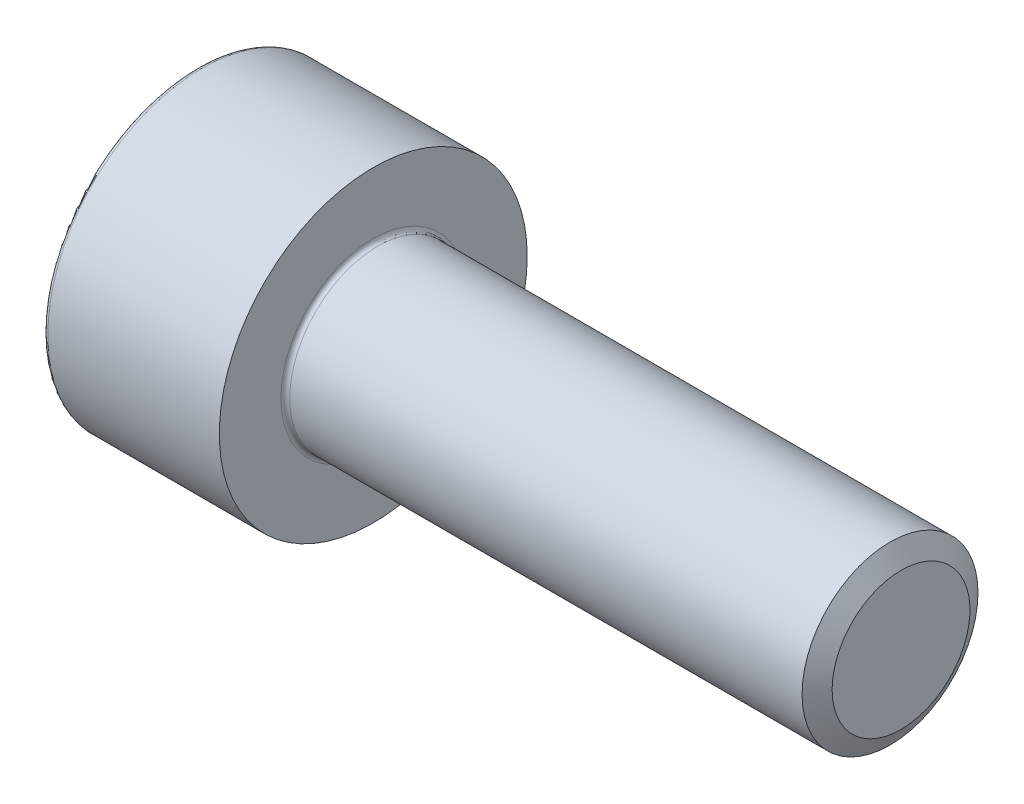
ISO-10303-21;
HEADER;
FILE_DESCRIPTION(('STEP AP214'),'2;1');
FILE_NAME('part.step','',(''),(''),'','','');
FILE_SCHEMA(('AUTOMOTIVE_DESIGN { 1 0 10303 214 1 1 1 1 }'));
ENDSEC;
DATA;
#1=APPLICATION_CONTEXT('core data for automotive mechanical design processes');
#2=APPLICATION_PROTOCOL_DEFINITION('international standard','automotive_design',2000,#1);
#3=PRODUCT_CONTEXT('',#1,'mechanical');
#4=PRODUCT('Part','Part','',(#3));
#5=PRODUCT_RELATED_PRODUCT_CATEGORY('part','',(#4));
#6=PRODUCT_DEFINITION_FORMATION('','',#4);
#7=PRODUCT_DEFINITION_CONTEXT('part definition',#1,'design');
#8=PRODUCT_DEFINITION('design','',#6,#7);
#9=PRODUCT_DEFINITION_SHAPE('','',#8);
#10=(LENGTH_UNIT() NAMED_UNIT(*) SI_UNIT(.MILLI.,.METRE.));
#11=(NAMED_UNIT(*) PLANE_ANGLE_UNIT() SI_UNIT($,.RADIAN.));
#12=(NAMED_UNIT(*) SI_UNIT($,.STERADIAN.) SOLID_ANGLE_UNIT());
#13=UNCERTAINTY_MEASURE_WITH_UNIT(LENGTH_MEASURE(1.E-05),#10,'distance_accuracy_value','');
#14=(GEOMETRIC_REPRESENTATION_CONTEXT(3) GLOBAL_UNCERTAINTY_ASSIGNED_CONTEXT((#13)) GLOBAL_UNIT_ASSIGNED_CONTEXT((#10,
#11,#12)) REPRESENTATION_CONTEXT('',''));
#15=CARTESIAN_POINT('',(0.,0.,0.));
#16=DIRECTION('',(0.,0.,1.));
#17=DIRECTION('',(1.,0.,0.));
#18=AXIS2_PLACEMENT_3D('',#15,#16,#17);
#19=CARTESIAN_POINT('',(0.,0.,0.));
#20=DIRECTION('',(1.,0.,0.));
#21=DIRECTION('',(0.,0.,-1.));
#22=AXIS2_PLACEMENT_3D('',#19,#20,#21);
#23=CYLINDRICAL_SURFACE('',#22,2.);
#24=CARTESIAN_POINT('',(4.1,0.,0.));
#25=DIRECTION('',(1.,0.,0.));
#26=DIRECTION('',(0.,0.,-1.));
#27=AXIS2_PLACEMENT_3D('',#24,#25,#26);
#28=CIRCLE('',#27,2.);
#29=CARTESIAN_POINT('',(4.1,0.,-2.));
#30=VERTEX_POINT('',#29);
#31=EDGE_CURVE('E154',#30,#30,#28,.T.);
#32=ORIENTED_EDGE('',*,*,#31,.T.);
#33=EDGE_LOOP('',(#32));
#34=FACE_BOUND('',#33,.T.);
#35=CARTESIAN_POINT('',(15.75,0.,0.));
#36=DIRECTION('',(-1.,0.,0.));
#37=DIRECTION('',(0.,0.,1.));
#38=AXIS2_PLACEMENT_3D('',#35,#36,#37);
#39=CIRCLE('',#38,2.);
#40=CARTESIAN_POINT('',(15.75,0.,2.));
#41=VERTEX_POINT('',#40);
#42=EDGE_CURVE('E299',#41,#41,#39,.T.);
#43=ORIENTED_EDGE('',*,*,#42,.T.);
#44=EDGE_LOOP('',(#43));
#45=FACE_BOUND('',#44,.T.);
#46=ADVANCED_FACE('F51',(#34,#45),#23,.T.);
#47=CARTESIAN_POINT('',(0.,0.,0.));
#48=DIRECTION('',(-1.,0.,0.));
#49=DIRECTION('',(0.,0.,1.));
#50=AXIS2_PLACEMENT_3D('',#47,#48,#49);
#51=PLANE('',#50);
#52=CARTESIAN_POINT('',(0.,0.,0.));
#53=DIRECTION('',(-1.,0.,0.));
#54=DIRECTION('',(0.,0.,1.));
#55=AXIS2_PLACEMENT_3D('',#52,#53,#54);
#56=CIRCLE('',#55,3.4);
#57=CARTESIAN_POINT('',(0.,0.,3.4));
#58=VERTEX_POINT('',#57);
#59=EDGE_CURVE('E11',#58,#58,#56,.T.);
#60=ORIENTED_EDGE('',*,*,#59,.T.);
#61=EDGE_LOOP('',(#60));
#62=FACE_BOUND('',#61,.T.);
#63=DIRECTION('',(0.,0.5,0.866025403784439));
#64=VECTOR('',#63,1.);
#65=CARTESIAN_POINT('',(0.,-1.7215,0.));
#66=LINE('',#65,#64);
#67=CARTESIAN_POINT('',(0.,-1.7215,0.));
#68=VERTEX_POINT('',#67);
#69=CARTESIAN_POINT('',(0.,-0.86075,1.49086273261491));
#70=VERTEX_POINT('',#69);
#71=EDGE_CURVE('E66',#68,#70,#66,.T.);
#72=ORIENTED_EDGE('',*,*,#71,.F.);
#73=DIRECTION('',(0.,-0.5,0.866025403784439));
#74=VECTOR('',#73,1.);
#75=CARTESIAN_POINT('',(0.,-0.86075,-1.49086273261491));
#76=LINE('',#75,#74);
#77=CARTESIAN_POINT('',(0.,-0.86075,-1.49086273261491));
#78=VERTEX_POINT('',#77);
#79=EDGE_CURVE('E150',#78,#68,#76,.T.);
#80=ORIENTED_EDGE('',*,*,#79,.F.);
#81=DIRECTION('',(0.,-1.,0.));
#82=VECTOR('',#81,1.);
#83=CARTESIAN_POINT('',(0.,0.86075,-1.49086273261491));
#84=LINE('',#83,#82);
#85=CARTESIAN_POINT('',(0.,0.86075,-1.49086273261491));
#86=VERTEX_POINT('',#85);
#87=EDGE_CURVE('E148',#86,#78,#84,.T.);
#88=ORIENTED_EDGE('',*,*,#87,.F.);
#89=DIRECTION('',(0.,-0.5,-0.866025403784439));
#90=VECTOR('',#89,1.);
#91=CARTESIAN_POINT('',(0.,1.7215,0.));
#92=LINE('',#91,#90);
#93=CARTESIAN_POINT('',(0.,1.7215,0.));
#94=VERTEX_POINT('',#93);
#95=EDGE_CURVE('E114',#94,#86,#92,.T.);
#96=ORIENTED_EDGE('',*,*,#95,.F.);
#97=DIRECTION('',(0.,0.5,-0.866025403784438));
#98=VECTOR('',#97,1.);
#99=CARTESIAN_POINT('',(0.,0.86075,1.49086273261491));
#100=LINE('',#99,#98);
#101=CARTESIAN_POINT('',(0.,0.86075,1.49086273261491));
#102=VERTEX_POINT('',#101);
#103=EDGE_CURVE('E144',#102,#94,#100,.T.);
#104=ORIENTED_EDGE('',*,*,#103,.F.);
#105=DIRECTION('',(0.,1.,0.));
#106=VECTOR('',#105,1.);
#107=CARTESIAN_POINT('',(0.,-0.86075,1.49086273261491));
#108=LINE('',#107,#106);
#109=EDGE_CURVE('E140',#70,#102,#108,.T.);
#110=ORIENTED_EDGE('',*,*,#109,.F.);
#111=EDGE_LOOP('',(#72,#80,#88,#96,#104,#110));
#112=FACE_BOUND('',#111,.T.);
#113=ADVANCED_FACE('F190',(#62,#112),#51,.T.);
#114=CARTESIAN_POINT('',(0.,0.,0.));
#115=DIRECTION('',(1.,0.,0.));
#116=DIRECTION('',(0.,0.,-1.));
#117=AXIS2_PLACEMENT_3D('',#114,#115,#116);
#118=CYLINDRICAL_SURFACE('',#117,3.5);
#119=CARTESIAN_POINT('',(0.1,0.,0.));
#120=DIRECTION('',(-1.,0.,0.));
#121=DIRECTION('',(0.,0.,1.));
#122=AXIS2_PLACEMENT_3D('',#119,#120,#121);
#123=CIRCLE('',#122,3.5);
#124=CARTESIAN_POINT('',(0.1,0.,3.5));
#125=VERTEX_POINT('',#124);
#126=EDGE_CURVE('E59',#125,#125,#123,.F.);
#127=ORIENTED_EDGE('',*,*,#126,.T.);
#128=EDGE_LOOP('',(#127));
#129=FACE_BOUND('',#128,.T.);
#130=CARTESIAN_POINT('',(4.,0.,0.));
#131=DIRECTION('',(1.,0.,0.));
#132=DIRECTION('',(0.,0.,-1.));
#133=AXIS2_PLACEMENT_3D('',#130,#131,#132);
#134=CIRCLE('',#133,3.5);
#135=CARTESIAN_POINT('',(4.,0.,-3.5));
#136=VERTEX_POINT('',#135);
#137=EDGE_CURVE('E165',#136,#136,#134,.T.);
#138=ORIENTED_EDGE('',*,*,#137,.F.);
#139=EDGE_LOOP('',(#138));
#140=FACE_BOUND('',#139,.T.);
#141=ADVANCED_FACE('F171',(#129,#140),#118,.T.);
#142=CARTESIAN_POINT('',(4.,3.5,0.));
#143=DIRECTION('',(1.,0.,0.));
#144=DIRECTION('',(0.,0.,-1.));
#145=AXIS2_PLACEMENT_3D('',#142,#143,#144);
#146=PLANE('',#145);
#147=ORIENTED_EDGE('',*,*,#137,.T.);
#148=EDGE_LOOP('',(#147));
#149=FACE_BOUND('',#148,.T.);
#150=CARTESIAN_POINT('',(4.,0.,0.));
#151=DIRECTION('',(1.,0.,0.));
#152=DIRECTION('',(0.,0.,-1.));
#153=AXIS2_PLACEMENT_3D('',#150,#151,#152);
#154=CIRCLE('',#153,2.1);
#155=CARTESIAN_POINT('',(4.,0.,-2.1));
#156=VERTEX_POINT('',#155);
#157=EDGE_CURVE('E162',#156,#156,#154,.T.);
#158=ORIENTED_EDGE('',*,*,#157,.F.);
#159=EDGE_LOOP('',(#158));
#160=FACE_BOUND('',#159,.T.);
#161=ADVANCED_FACE('F205',(#149,#160),#146,.T.);
#162=CARTESIAN_POINT('',(4.1,0.,0.));
#163=DIRECTION('',(1.,0.,0.));
#164=DIRECTION('',(0.,0.,-1.));
#165=AXIS2_PLACEMENT_3D('',#162,#163,#164);
#166=TOROIDAL_SURFACE('',#165,2.1,0.1);
#167=ORIENTED_EDGE('',*,*,#157,.T.);
#168=EDGE_LOOP('',(#167));
#169=FACE_BOUND('',#168,.T.);
#170=ORIENTED_EDGE('',*,*,#31,.F.);
#171=EDGE_LOOP('',(#170));
#172=FACE_BOUND('',#171,.T.);
#173=ADVANCED_FACE('F201',(#169,#172),#166,.F.);
#174=CARTESIAN_POINT('',(1.4,-1.7215,0.));
#175=DIRECTION('',(0.,-0.866025403784439,0.5));
#176=DIRECTION('',(0.,-0.5,-0.866025403784439));
#177=AXIS2_PLACEMENT_3D('',#174,#175,#176);
#178=PLANE('',#177);
#179=ORIENTED_EDGE('',*,*,#71,.T.);
#180=DIRECTION('',(-1.,0.,0.));
#181=VECTOR('',#180,1.);
#182=CARTESIAN_POINT('',(1.4,-0.86075,1.49086273261491));
#183=LINE('',#182,#181);
#184=CARTESIAN_POINT('',(1.4,-0.86075,1.49086273261491));
#185=VERTEX_POINT('',#184);
#186=EDGE_CURVE('E96',#185,#70,#183,.T.);
#187=ORIENTED_EDGE('',*,*,#186,.F.);
#188=DIRECTION('',(0.,0.5,0.866025403784439));
#189=VECTOR('',#188,1.);
#190=CARTESIAN_POINT('',(1.4,-1.7215,0.));
#191=LINE('',#190,#189);
#192=CARTESIAN_POINT('',(1.4,-1.7215,0.));
#193=VERTEX_POINT('',#192);
#194=EDGE_CURVE('E152',#193,#185,#191,.T.);
#195=ORIENTED_EDGE('',*,*,#194,.F.);
#196=DIRECTION('',(-1.,0.,0.));
#197=VECTOR('',#196,1.);
#198=CARTESIAN_POINT('',(1.4,-1.7215,0.));
#199=LINE('',#198,#197);
#200=EDGE_CURVE('E74',#193,#68,#199,.T.);
#201=ORIENTED_EDGE('',*,*,#200,.T.);
#202=EDGE_LOOP('',(#179,#187,#195,#201));
#203=FACE_BOUND('',#202,.T.);
#204=ADVANCED_FACE('F204',(#203),#178,.F.);
#205=CARTESIAN_POINT('',(1.4,-0.86075,-1.49086273261491));
#206=DIRECTION('',(0.,-0.866025403784439,-0.5));
#207=DIRECTION('',(0.,0.5,-0.866025403784439));
#208=AXIS2_PLACEMENT_3D('',#205,#206,#207);
#209=PLANE('',#208);
#210=ORIENTED_EDGE('',*,*,#79,.T.);
#211=ORIENTED_EDGE('',*,*,#200,.F.);
#212=DIRECTION('',(0.,-0.5,0.866025403784439));
#213=VECTOR('',#212,1.);
#214=CARTESIAN_POINT('',(1.4,-0.86075,-1.49086273261491));
#215=LINE('',#214,#213);
#216=CARTESIAN_POINT('',(1.4,-0.86075,-1.49086273261491));
#217=VERTEX_POINT('',#216);
#218=EDGE_CURVE('E126',#217,#193,#215,.T.);
#219=ORIENTED_EDGE('',*,*,#218,.F.);
#220=DIRECTION('',(-1.,0.,0.));
#221=VECTOR('',#220,1.);
#222=CARTESIAN_POINT('',(1.4,-0.86075,-1.49086273261491));
#223=LINE('',#222,#221);
#224=EDGE_CURVE('E118',#217,#78,#223,.T.);
#225=ORIENTED_EDGE('',*,*,#224,.T.);
#226=EDGE_LOOP('',(#210,#211,#219,#225));
#227=FACE_BOUND('',#226,.T.);
#228=ADVANCED_FACE('F254',(#227),#209,.F.);
#229=CARTESIAN_POINT('',(1.4,0.86075,-1.49086273261491));
#230=DIRECTION('',(0.,0.,-1.));
#231=DIRECTION('',(0.,1.,0.));
#232=AXIS2_PLACEMENT_3D('',#229,#230,#231);
#233=PLANE('',#232);
#234=ORIENTED_EDGE('',*,*,#87,.T.);
#235=ORIENTED_EDGE('',*,*,#224,.F.);
#236=DIRECTION('',(0.,-1.,0.));
#237=VECTOR('',#236,1.);
#238=CARTESIAN_POINT('',(1.4,0.86075,-1.49086273261491));
#239=LINE('',#238,#237);
#240=CARTESIAN_POINT('',(1.4,0.86075,-1.49086273261491));
#241=VERTEX_POINT('',#240);
#242=EDGE_CURVE('E122',#241,#217,#239,.T.);
#243=ORIENTED_EDGE('',*,*,#242,.F.);
#244=DIRECTION('',(-1.,0.,0.));
#245=VECTOR('',#244,1.);
#246=CARTESIAN_POINT('',(1.4,0.86075,-1.49086273261491));
#247=LINE('',#246,#245);
#248=EDGE_CURVE('E107',#241,#86,#247,.T.);
#249=ORIENTED_EDGE('',*,*,#248,.T.);
#250=EDGE_LOOP('',(#234,#235,#243,#249));
#251=FACE_BOUND('',#250,.T.);
#252=ADVANCED_FACE('F123',(#251),#233,.F.);
#253=CARTESIAN_POINT('',(1.4,1.7215,0.));
#254=DIRECTION('',(0.,0.866025403784439,-0.5));
#255=DIRECTION('',(0.,0.5,0.866025403784439));
#256=AXIS2_PLACEMENT_3D('',#253,#254,#255);
#257=PLANE('',#256);
#258=ORIENTED_EDGE('',*,*,#95,.T.);
#259=ORIENTED_EDGE('',*,*,#248,.F.);
#260=DIRECTION('',(0.,-0.5,-0.866025403784439));
#261=VECTOR('',#260,1.);
#262=CARTESIAN_POINT('',(1.4,1.7215,0.));
#263=LINE('',#262,#261);
#264=CARTESIAN_POINT('',(1.4,1.7215,0.));
#265=VERTEX_POINT('',#264);
#266=EDGE_CURVE('E111',#265,#241,#263,.T.);
#267=ORIENTED_EDGE('',*,*,#266,.F.);
#268=DIRECTION('',(-1.,0.,0.));
#269=VECTOR('',#268,1.);
#270=CARTESIAN_POINT('',(1.4,1.7215,0.));
#271=LINE('',#270,#269);
#272=EDGE_CURVE('E119',#265,#94,#271,.T.);
#273=ORIENTED_EDGE('',*,*,#272,.T.);
#274=EDGE_LOOP('',(#258,#259,#267,#273));
#275=FACE_BOUND('',#274,.T.);
#276=ADVANCED_FACE('F109',(#275),#257,.F.);
#277=CARTESIAN_POINT('',(1.4,0.86075,1.49086273261491));
#278=DIRECTION('',(0.,0.866025403784439,0.5));
#279=DIRECTION('',(0.,-0.5,0.866025403784439));
#280=AXIS2_PLACEMENT_3D('',#277,#278,#279);
#281=PLANE('',#280);
#282=ORIENTED_EDGE('',*,*,#103,.T.);
#283=ORIENTED_EDGE('',*,*,#272,.F.);
#284=DIRECTION('',(0.,0.5,-0.866025403784438));
#285=VECTOR('',#284,1.);
#286=CARTESIAN_POINT('',(1.4,0.86075,1.49086273261491));
#287=LINE('',#286,#285);
#288=CARTESIAN_POINT('',(1.4,0.86075,1.49086273261491));
#289=VERTEX_POINT('',#288);
#290=EDGE_CURVE('E132',#289,#265,#287,.T.);
#291=ORIENTED_EDGE('',*,*,#290,.F.);
#292=DIRECTION('',(-1.,0.,0.));
#293=VECTOR('',#292,1.);
#294=CARTESIAN_POINT('',(1.4,0.86075,1.49086273261491));
#295=LINE('',#294,#293);
#296=EDGE_CURVE('E157',#289,#102,#295,.T.);
#297=ORIENTED_EDGE('',*,*,#296,.T.);
#298=EDGE_LOOP('',(#282,#283,#291,#297));
#299=FACE_BOUND('',#298,.T.);
#300=ADVANCED_FACE('F230',(#299),#281,.F.);
#301=CARTESIAN_POINT('',(1.4,-0.86075,1.49086273261491));
#302=DIRECTION('',(0.,0.,1.));
#303=DIRECTION('',(0.,-1.,0.));
#304=AXIS2_PLACEMENT_3D('',#301,#302,#303);
#305=PLANE('',#304);
#306=ORIENTED_EDGE('',*,*,#109,.T.);
#307=ORIENTED_EDGE('',*,*,#296,.F.);
#308=DIRECTION('',(0.,1.,0.));
#309=VECTOR('',#308,1.);
#310=CARTESIAN_POINT('',(1.4,-0.86075,1.49086273261491));
#311=LINE('',#310,#309);
#312=EDGE_CURVE('E134',#185,#289,#311,.T.);
#313=ORIENTED_EDGE('',*,*,#312,.F.);
#314=ORIENTED_EDGE('',*,*,#186,.T.);
#315=EDGE_LOOP('',(#306,#307,#313,#314));
#316=FACE_BOUND('',#315,.T.);
#317=ADVANCED_FACE('F186',(#316),#305,.F.);
#318=CARTESIAN_POINT('',(1.4,-0.86075,1.49086273261491));
#319=DIRECTION('',(-1.,0.,0.));
#320=DIRECTION('',(0.,0.,1.));
#321=AXIS2_PLACEMENT_3D('',#318,#319,#320);
#322=PLANE('',#321);
#323=ORIENTED_EDGE('',*,*,#194,.T.);
#324=ORIENTED_EDGE('',*,*,#312,.T.);
#325=ORIENTED_EDGE('',*,*,#290,.T.);
#326=ORIENTED_EDGE('',*,*,#266,.T.);
#327=ORIENTED_EDGE('',*,*,#242,.T.);
#328=ORIENTED_EDGE('',*,*,#218,.T.);
#329=EDGE_LOOP('',(#323,#324,#325,#326,#327,#328));
#330=FACE_BOUND('',#329,.T.);
#331=ADVANCED_FACE('F129',(#330),#322,.T.);
#332=CARTESIAN_POINT('',(0.1,0.,0.));
#333=DIRECTION('',(-1.,0.,0.));
#334=DIRECTION('',(0.,0.,1.));
#335=AXIS2_PLACEMENT_3D('',#332,#333,#334);
#336=TOROIDAL_SURFACE('',#335,3.4,0.1);
#337=ORIENTED_EDGE('',*,*,#59,.F.);
#338=EDGE_LOOP('',(#337));
#339=FACE_BOUND('',#338,.T.);
#340=ORIENTED_EDGE('',*,*,#126,.F.);
#341=EDGE_LOOP('',(#340));
#342=FACE_BOUND('',#341,.T.);
#343=ADVANCED_FACE('F53',(#339,#342),#336,.T.);
#344=CARTESIAN_POINT('',(15.75,0.,0.));
#345=DIRECTION('',(-1.,0.,0.));
#346=DIRECTION('',(0.,0.,1.));
#347=AXIS2_PLACEMENT_3D('',#344,#345,#346);
#348=CONICAL_SURFACE('',#347,2.,1.04718484902493);
#349=CARTESIAN_POINT('',(16.,0.,0.));
#350=DIRECTION('',(-1.,0.,0.));
#351=DIRECTION('',(0.,0.,1.));
#352=AXIS2_PLACEMENT_3D('',#349,#350,#351);
#353=CIRCLE('',#352,1.567);
#354=CARTESIAN_POINT('',(16.,0.,1.567));
#355=VERTEX_POINT('',#354);
#356=EDGE_CURVE('E141',#355,#355,#353,.T.);
#357=ORIENTED_EDGE('',*,*,#356,.T.);
#358=EDGE_LOOP('',(#357));
#359=FACE_BOUND('',#358,.T.);
#360=ORIENTED_EDGE('',*,*,#42,.F.);
#361=EDGE_LOOP('',(#360));
#362=FACE_BOUND('',#361,.T.);
#363=ADVANCED_FACE('F175',(#359,#362),#348,.T.);
#364=CARTESIAN_POINT('',(16.,2.,0.));
#365=DIRECTION('',(1.,0.,0.));
#366=DIRECTION('',(0.,0.,-1.));
#367=AXIS2_PLACEMENT_3D('',#364,#365,#366);
#368=PLANE('',#367);
#369=ORIENTED_EDGE('',*,*,#356,.F.);
#370=EDGE_LOOP('',(#369));
#371=FACE_BOUND('',#370,.T.);
#372=ADVANCED_FACE('F182',(#371),#368,.T.);
#373=CLOSED_SHELL('',(#46,#113,#141,#161,#173,#204,#228,#252,#276,#300,#317,#331,#343,#363,#372));
#374=MANIFOLD_SOLID_BREP('B2',#373);
#375=ADVANCED_BREP_SHAPE_REPRESENTATION('',(#18,#374),#14);
#376=SHAPE_DEFINITION_REPRESENTATION(#9,#375);
ENDSEC;
END-ISO-10303-21;
